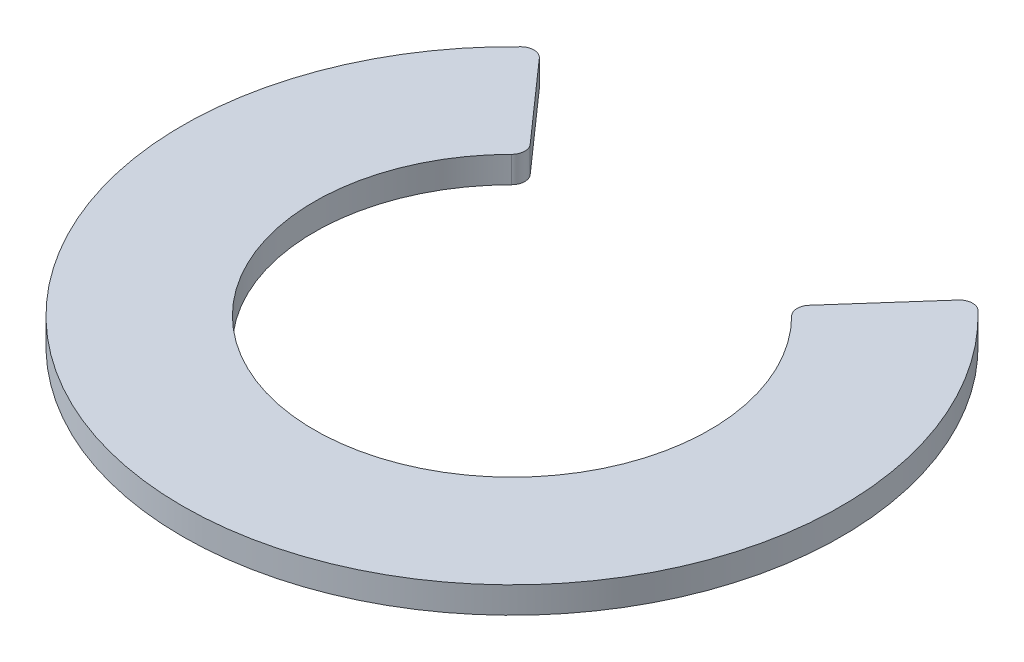
ISO-10303-21;
HEADER;
FILE_DESCRIPTION(('STEP AP214'),'2;1');
FILE_NAME('part.step','',(''),(''),'','','');
FILE_SCHEMA(('AUTOMOTIVE_DESIGN { 1 0 10303 214 1 1 1 1 }'));
ENDSEC;
DATA;
#1=APPLICATION_CONTEXT('core data for automotive mechanical design processes');
#2=APPLICATION_PROTOCOL_DEFINITION('international standard','automotive_design',2000,#1);
#3=PRODUCT_CONTEXT('',#1,'mechanical');
#4=PRODUCT('Part','Part','',(#3));
#5=PRODUCT_RELATED_PRODUCT_CATEGORY('part','',(#4));
#6=PRODUCT_DEFINITION_FORMATION('','',#4);
#7=PRODUCT_DEFINITION_CONTEXT('part definition',#1,'design');
#8=PRODUCT_DEFINITION('design','',#6,#7);
#9=PRODUCT_DEFINITION_SHAPE('','',#8);
#10=(LENGTH_UNIT() NAMED_UNIT(*) SI_UNIT(.MILLI.,.METRE.));
#11=(NAMED_UNIT(*) PLANE_ANGLE_UNIT() SI_UNIT($,.RADIAN.));
#12=(NAMED_UNIT(*) SI_UNIT($,.STERADIAN.) SOLID_ANGLE_UNIT());
#13=UNCERTAINTY_MEASURE_WITH_UNIT(LENGTH_MEASURE(1.E-05),#10,'distance_accuracy_value','');
#14=(GEOMETRIC_REPRESENTATION_CONTEXT(3) GLOBAL_UNCERTAINTY_ASSIGNED_CONTEXT((#13)) GLOBAL_UNIT_ASSIGNED_CONTEXT((#10,
#11,#12)) REPRESENTATION_CONTEXT('',''));
#15=CARTESIAN_POINT('',(0.,0.,0.));
#16=DIRECTION('',(0.,0.,1.));
#17=DIRECTION('',(1.,0.,0.));
#18=AXIS2_PLACEMENT_3D('',#15,#16,#17);
#19=CARTESIAN_POINT('',(0.,0.2,0.));
#20=DIRECTION('',(0.,-1.,0.));
#21=DIRECTION('',(0.,0.,-1.));
#22=AXIS2_PLACEMENT_3D('',#19,#20,#21);
#23=CYLINDRICAL_SURFACE('',#22,2.5);
#24=CARTESIAN_POINT('',(0.,0.,0.));
#25=DIRECTION('',(0.,1.,0.));
#26=DIRECTION('',(0.,0.,1.));
#27=AXIS2_PLACEMENT_3D('',#24,#25,#26);
#28=CIRCLE('',#27,2.5);
#29=CARTESIAN_POINT('',(-1.7330783771635,0.,-1.80178781731044));
#30=VERTEX_POINT('',#29);
#31=CARTESIAN_POINT('',(1.7330783771635,0.,-1.80178781731044));
#32=VERTEX_POINT('',#31);
#33=EDGE_CURVE('E129',#30,#32,#28,.T.);
#34=ORIENTED_EDGE('',*,*,#33,.T.);
#35=DIRECTION('',(0.,-1.,0.));
#36=VECTOR('',#35,1.);
#37=CARTESIAN_POINT('',(1.7330783771635,0.2,-1.80178781731044));
#38=LINE('',#37,#36);
#39=CARTESIAN_POINT('',(1.7330783771635,0.2,-1.80178781731044));
#40=VERTEX_POINT('',#39);
#41=EDGE_CURVE('E152',#32,#40,#38,.F.);
#42=ORIENTED_EDGE('',*,*,#41,.T.);
#43=CARTESIAN_POINT('',(0.,0.2,0.));
#44=DIRECTION('',(0.,1.,0.));
#45=DIRECTION('',(0.,0.,1.));
#46=AXIS2_PLACEMENT_3D('',#43,#44,#45);
#47=CIRCLE('',#46,2.5);
#48=CARTESIAN_POINT('',(-1.7330783771635,0.2,-1.80178781731044));
#49=VERTEX_POINT('',#48);
#50=EDGE_CURVE('E127',#49,#40,#47,.T.);
#51=ORIENTED_EDGE('',*,*,#50,.F.);
#52=DIRECTION('',(0.,-1.,0.));
#53=VECTOR('',#52,1.);
#54=CARTESIAN_POINT('',(-1.7330783771635,0.2,-1.80178781731044));
#55=LINE('',#54,#53);
#56=EDGE_CURVE('E149',#49,#30,#55,.T.);
#57=ORIENTED_EDGE('',*,*,#56,.T.);
#58=EDGE_LOOP('',(#34,#42,#51,#57));
#59=FACE_BOUND('',#58,.T.);
#60=ADVANCED_FACE('F34',(#59),#23,.T.);
#61=CARTESIAN_POINT('',(0.993899293763784,0.2,-1.12346081100137));
#62=DIRECTION('',(0.748973874000912,0.,0.662599529175856));
#63=DIRECTION('',(0.662599529175856,0.,-0.748973874000912));
#64=AXIS2_PLACEMENT_3D('',#61,#62,#63);
#65=PLANE('',#64);
#66=DIRECTION('',(-0.662599529175856,0.,0.748973874000912));
#67=VECTOR('',#66,1.);
#68=CARTESIAN_POINT('',(0.993899293763784,0.,-1.12346081100137));
#69=LINE('',#68,#67);
#70=CARTESIAN_POINT('',(1.58885785467687,0.,-1.79597625753561));
#71=VERTEX_POINT('',#70);
#72=CARTESIAN_POINT('',(1.05808659710034,0.,-1.19601536488317));
#73=VERTEX_POINT('',#72);
#74=EDGE_CURVE('E125',#71,#73,#69,.T.);
#75=ORIENTED_EDGE('',*,*,#74,.T.);
#76=DIRECTION('',(0.,-1.,0.));
#77=VECTOR('',#76,1.);
#78=CARTESIAN_POINT('',(1.05808659710034,0.2,-1.19601536488317));
#79=LINE('',#78,#77);
#80=CARTESIAN_POINT('',(1.05808659710034,0.2,-1.19601536488317));
#81=VERTEX_POINT('',#80);
#82=EDGE_CURVE('E104',#73,#81,#79,.F.);
#83=ORIENTED_EDGE('',*,*,#82,.T.);
#84=DIRECTION('',(-0.662599529175856,0.,0.748973874000912));
#85=VECTOR('',#84,1.);
#86=CARTESIAN_POINT('',(0.993899293763784,0.2,-1.12346081100137));
#87=LINE('',#86,#85);
#88=CARTESIAN_POINT('',(1.58885785467687,0.2,-1.79597625753561));
#89=VERTEX_POINT('',#88);
#90=EDGE_CURVE('E168',#89,#81,#87,.T.);
#91=ORIENTED_EDGE('',*,*,#90,.F.);
#92=DIRECTION('',(0.,-1.,0.));
#93=VECTOR('',#92,1.);
#94=CARTESIAN_POINT('',(1.58885785467687,0.2,-1.79597625753561));
#95=LINE('',#94,#93);
#96=EDGE_CURVE('E109',#89,#71,#95,.T.);
#97=ORIENTED_EDGE('',*,*,#96,.T.);
#98=EDGE_LOOP('',(#75,#83,#91,#97));
#99=FACE_BOUND('',#98,.T.);
#100=ADVANCED_FACE('F185',(#99),#65,.F.);
#101=CARTESIAN_POINT('',(0.,0.2,0.));
#102=DIRECTION('',(0.,-1.,0.));
#103=DIRECTION('',(0.,0.,-1.));
#104=AXIS2_PLACEMENT_3D('',#101,#102,#103);
#105=CYLINDRICAL_SURFACE('',#104,1.5);
#106=CARTESIAN_POINT('',(0.,0.2,0.));
#107=DIRECTION('',(0.,-1.,0.));
#108=DIRECTION('',(0.,0.,1.));
#109=AXIS2_PLACEMENT_3D('',#106,#107,#108);
#110=CIRCLE('',#109,1.5);
#111=CARTESIAN_POINT('',(1.06217248546915,0.2,-1.05914569871774));
#112=VERTEX_POINT('',#111);
#113=CARTESIAN_POINT('',(-1.06217248546915,0.2,-1.05914569871774));
#114=VERTEX_POINT('',#113);
#115=EDGE_CURVE('E118',#112,#114,#110,.T.);
#116=ORIENTED_EDGE('',*,*,#115,.F.);
#117=DIRECTION('',(0.,-1.,0.));
#118=VECTOR('',#117,1.);
#119=CARTESIAN_POINT('',(1.06217248546915,0.2,-1.05914569871774));
#120=LINE('',#119,#118);
#121=CARTESIAN_POINT('',(1.06217248546915,0.,-1.05914569871774));
#122=VERTEX_POINT('',#121);
#123=EDGE_CURVE('E103',#112,#122,#120,.T.);
#124=ORIENTED_EDGE('',*,*,#123,.T.);
#125=CARTESIAN_POINT('',(0.,0.,0.));
#126=DIRECTION('',(0.,-1.,0.));
#127=DIRECTION('',(0.,0.,1.));
#128=AXIS2_PLACEMENT_3D('',#125,#126,#127);
#129=CIRCLE('',#128,1.5);
#130=CARTESIAN_POINT('',(-1.06217248546915,0.,-1.05914569871774));
#131=VERTEX_POINT('',#130);
#132=EDGE_CURVE('E116',#122,#131,#129,.T.);
#133=ORIENTED_EDGE('',*,*,#132,.T.);
#134=DIRECTION('',(0.,-1.,0.));
#135=VECTOR('',#134,1.);
#136=CARTESIAN_POINT('',(-1.06217248546915,0.2,-1.05914569871774));
#137=LINE('',#136,#135);
#138=EDGE_CURVE('E120',#131,#114,#137,.F.);
#139=ORIENTED_EDGE('',*,*,#138,.T.);
#140=EDGE_LOOP('',(#116,#124,#133,#139));
#141=FACE_BOUND('',#140,.T.);
#142=ADVANCED_FACE('F115',(#141),#105,.F.);
#143=CARTESIAN_POINT('',(-1.65649882293964,0.2,-1.87243468500228));
#144=DIRECTION('',(-0.748973874000912,0.,0.662599529175856));
#145=DIRECTION('',(0.662599529175856,0.,0.748973874000912));
#146=AXIS2_PLACEMENT_3D('',#143,#144,#145);
#147=PLANE('',#146);
#148=DIRECTION('',(-0.662599529175856,0.,-0.748973874000912));
#149=VECTOR('',#148,1.);
#150=CARTESIAN_POINT('',(-1.65649882293964,0.,-1.87243468500228));
#151=LINE('',#150,#149);
#152=CARTESIAN_POINT('',(-1.05808659710034,0.,-1.19601536488317));
#153=VERTEX_POINT('',#152);
#154=CARTESIAN_POINT('',(-1.58885785467687,0.,-1.79597625753561));
#155=VERTEX_POINT('',#154);
#156=EDGE_CURVE('E124',#153,#155,#151,.T.);
#157=ORIENTED_EDGE('',*,*,#156,.T.);
#158=DIRECTION('',(0.,-1.,0.));
#159=VECTOR('',#158,1.);
#160=CARTESIAN_POINT('',(-1.58885785467687,0.2,-1.79597625753561));
#161=LINE('',#160,#159);
#162=CARTESIAN_POINT('',(-1.58885785467687,0.2,-1.79597625753561));
#163=VERTEX_POINT('',#162);
#164=EDGE_CURVE('E11',#155,#163,#161,.F.);
#165=ORIENTED_EDGE('',*,*,#164,.T.);
#166=DIRECTION('',(-0.662599529175856,0.,-0.748973874000912));
#167=VECTOR('',#166,1.);
#168=CARTESIAN_POINT('',(-1.65649882293964,0.2,-1.87243468500228));
#169=LINE('',#168,#167);
#170=CARTESIAN_POINT('',(-1.05808659710034,0.2,-1.19601536488317));
#171=VERTEX_POINT('',#170);
#172=EDGE_CURVE('E133',#171,#163,#169,.T.);
#173=ORIENTED_EDGE('',*,*,#172,.F.);
#174=DIRECTION('',(0.,-1.,0.));
#175=VECTOR('',#174,1.);
#176=CARTESIAN_POINT('',(-1.05808659710034,0.2,-1.19601536488317));
#177=LINE('',#176,#175);
#178=EDGE_CURVE('E42',#171,#153,#177,.T.);
#179=ORIENTED_EDGE('',*,*,#178,.T.);
#180=EDGE_LOOP('',(#157,#165,#173,#179));
#181=FACE_BOUND('',#180,.T.);
#182=ADVANCED_FACE('F155',(#181),#147,.F.);
#183=CARTESIAN_POINT('',(0.,0.2,0.));
#184=DIRECTION('',(0.,1.,0.));
#185=DIRECTION('',(0.,0.,1.));
#186=AXIS2_PLACEMENT_3D('',#183,#184,#185);
#187=PLANE('',#186);
#188=ORIENTED_EDGE('',*,*,#90,.T.);
#189=CARTESIAN_POINT('',(1.13298398450043,0.2,-1.12975541196559));
#190=DIRECTION('',(0.,1.,0.));
#191=DIRECTION('',(0.,0.,1.));
#192=AXIS2_PLACEMENT_3D('',#189,#190,#191);
#193=CIRCLE('',#192,0.1);
#194=EDGE_CURVE('E147',#81,#112,#193,.T.);
#195=ORIENTED_EDGE('',*,*,#194,.T.);
#196=ORIENTED_EDGE('',*,*,#115,.T.);
#197=CARTESIAN_POINT('',(-1.13298398450043,0.2,-1.12975541196559));
#198=DIRECTION('',(0.,1.,0.));
#199=DIRECTION('',(0.,0.,1.));
#200=AXIS2_PLACEMENT_3D('',#197,#198,#199);
#201=CIRCLE('',#200,0.1);
#202=EDGE_CURVE('E54',#114,#171,#201,.T.);
#203=ORIENTED_EDGE('',*,*,#202,.T.);
#204=ORIENTED_EDGE('',*,*,#172,.T.);
#205=CARTESIAN_POINT('',(-1.66375524207696,0.2,-1.72971630461803));
#206=DIRECTION('',(0.,1.,0.));
#207=DIRECTION('',(0.,0.,1.));
#208=AXIS2_PLACEMENT_3D('',#205,#206,#207);
#209=CIRCLE('',#208,0.1);
#210=EDGE_CURVE('E143',#163,#49,#209,.T.);
#211=ORIENTED_EDGE('',*,*,#210,.T.);
#212=ORIENTED_EDGE('',*,*,#50,.T.);
#213=CARTESIAN_POINT('',(1.66375524207696,0.2,-1.72971630461803));
#214=DIRECTION('',(0.,1.,0.));
#215=DIRECTION('',(0.,0.,1.));
#216=AXIS2_PLACEMENT_3D('',#213,#214,#215);
#217=CIRCLE('',#216,0.1);
#218=EDGE_CURVE('E145',#40,#89,#217,.T.);
#219=ORIENTED_EDGE('',*,*,#218,.T.);
#220=EDGE_LOOP('',(#188,#195,#196,#203,#204,#211,#212,#219));
#221=FACE_BOUND('',#220,.T.);
#222=ADVANCED_FACE('F174',(#221),#187,.T.);
#223=CARTESIAN_POINT('',(0.,0.,0.));
#224=DIRECTION('',(0.,1.,0.));
#225=DIRECTION('',(0.,0.,1.));
#226=AXIS2_PLACEMENT_3D('',#223,#224,#225);
#227=PLANE('',#226);
#228=ORIENTED_EDGE('',*,*,#132,.F.);
#229=CARTESIAN_POINT('',(1.13298398450043,0.,-1.12975541196559));
#230=DIRECTION('',(0.,1.,0.));
#231=DIRECTION('',(0.,0.,1.));
#232=AXIS2_PLACEMENT_3D('',#229,#230,#231);
#233=CIRCLE('',#232,0.1);
#234=EDGE_CURVE('E99',#122,#73,#233,.F.);
#235=ORIENTED_EDGE('',*,*,#234,.T.);
#236=ORIENTED_EDGE('',*,*,#74,.F.);
#237=CARTESIAN_POINT('',(1.66375524207696,0.,-1.72971630461803));
#238=DIRECTION('',(0.,1.,0.));
#239=DIRECTION('',(0.,0.,1.));
#240=AXIS2_PLACEMENT_3D('',#237,#238,#239);
#241=CIRCLE('',#240,0.1);
#242=EDGE_CURVE('E110',#71,#32,#241,.F.);
#243=ORIENTED_EDGE('',*,*,#242,.T.);
#244=ORIENTED_EDGE('',*,*,#33,.F.);
#245=CARTESIAN_POINT('',(-1.66375524207696,0.,-1.72971630461803));
#246=DIRECTION('',(0.,1.,0.));
#247=DIRECTION('',(0.,0.,1.));
#248=AXIS2_PLACEMENT_3D('',#245,#246,#247);
#249=CIRCLE('',#248,0.1);
#250=EDGE_CURVE('E136',#30,#155,#249,.F.);
#251=ORIENTED_EDGE('',*,*,#250,.T.);
#252=ORIENTED_EDGE('',*,*,#156,.F.);
#253=CARTESIAN_POINT('',(-1.13298398450043,0.,-1.12975541196559));
#254=DIRECTION('',(0.,1.,0.));
#255=DIRECTION('',(0.,0.,1.));
#256=AXIS2_PLACEMENT_3D('',#253,#254,#255);
#257=CIRCLE('',#256,0.1);
#258=EDGE_CURVE('E119',#153,#131,#257,.F.);
#259=ORIENTED_EDGE('',*,*,#258,.T.);
#260=EDGE_LOOP('',(#228,#235,#236,#243,#244,#251,#252,#259));
#261=FACE_BOUND('',#260,.T.);
#262=ADVANCED_FACE('F122',(#261),#227,.F.);
#263=CARTESIAN_POINT('',(1.13298398450043,0.2,-1.12975541196559));
#264=DIRECTION('',(0.,-1.,0.));
#265=DIRECTION('',(0.,0.,-1.));
#266=AXIS2_PLACEMENT_3D('',#263,#264,#265);
#267=CYLINDRICAL_SURFACE('',#266,0.1);
#268=ORIENTED_EDGE('',*,*,#194,.F.);
#269=ORIENTED_EDGE('',*,*,#82,.F.);
#270=ORIENTED_EDGE('',*,*,#234,.F.);
#271=ORIENTED_EDGE('',*,*,#123,.F.);
#272=EDGE_LOOP('',(#268,#269,#270,#271));
#273=FACE_BOUND('',#272,.T.);
#274=ADVANCED_FACE('F102',(#273),#267,.T.);
#275=CARTESIAN_POINT('',(1.66375524207696,0.2,-1.72971630461803));
#276=DIRECTION('',(0.,-1.,0.));
#277=DIRECTION('',(0.,0.,-1.));
#278=AXIS2_PLACEMENT_3D('',#275,#276,#277);
#279=CYLINDRICAL_SURFACE('',#278,0.1);
#280=ORIENTED_EDGE('',*,*,#218,.F.);
#281=ORIENTED_EDGE('',*,*,#41,.F.);
#282=ORIENTED_EDGE('',*,*,#242,.F.);
#283=ORIENTED_EDGE('',*,*,#96,.F.);
#284=EDGE_LOOP('',(#280,#281,#282,#283));
#285=FACE_BOUND('',#284,.T.);
#286=ADVANCED_FACE('F196',(#285),#279,.T.);
#287=CARTESIAN_POINT('',(-1.66375524207696,0.2,-1.72971630461803));
#288=DIRECTION('',(0.,-1.,0.));
#289=DIRECTION('',(0.,0.,-1.));
#290=AXIS2_PLACEMENT_3D('',#287,#288,#289);
#291=CYLINDRICAL_SURFACE('',#290,0.1);
#292=ORIENTED_EDGE('',*,*,#210,.F.);
#293=ORIENTED_EDGE('',*,*,#164,.F.);
#294=ORIENTED_EDGE('',*,*,#250,.F.);
#295=ORIENTED_EDGE('',*,*,#56,.F.);
#296=EDGE_LOOP('',(#292,#293,#294,#295));
#297=FACE_BOUND('',#296,.T.);
#298=ADVANCED_FACE('F162',(#297),#291,.T.);
#299=CARTESIAN_POINT('',(-1.13298398450043,0.2,-1.12975541196559));
#300=DIRECTION('',(0.,-1.,0.));
#301=DIRECTION('',(0.,0.,-1.));
#302=AXIS2_PLACEMENT_3D('',#299,#300,#301);
#303=CYLINDRICAL_SURFACE('',#302,0.1);
#304=ORIENTED_EDGE('',*,*,#202,.F.);
#305=ORIENTED_EDGE('',*,*,#138,.F.);
#306=ORIENTED_EDGE('',*,*,#258,.F.);
#307=ORIENTED_EDGE('',*,*,#178,.F.);
#308=EDGE_LOOP('',(#304,#305,#306,#307));
#309=FACE_BOUND('',#308,.T.);
#310=ADVANCED_FACE('F36',(#309),#303,.T.);
#311=CLOSED_SHELL('',(#60,#100,#142,#182,#222,#262,#274,#286,#298,#310));
#312=MANIFOLD_SOLID_BREP('B2',#311);
#313=ADVANCED_BREP_SHAPE_REPRESENTATION('',(#18,#312),#14);
#314=SHAPE_DEFINITION_REPRESENTATION(#9,#313);
ENDSEC;
END-ISO-10303-21;
